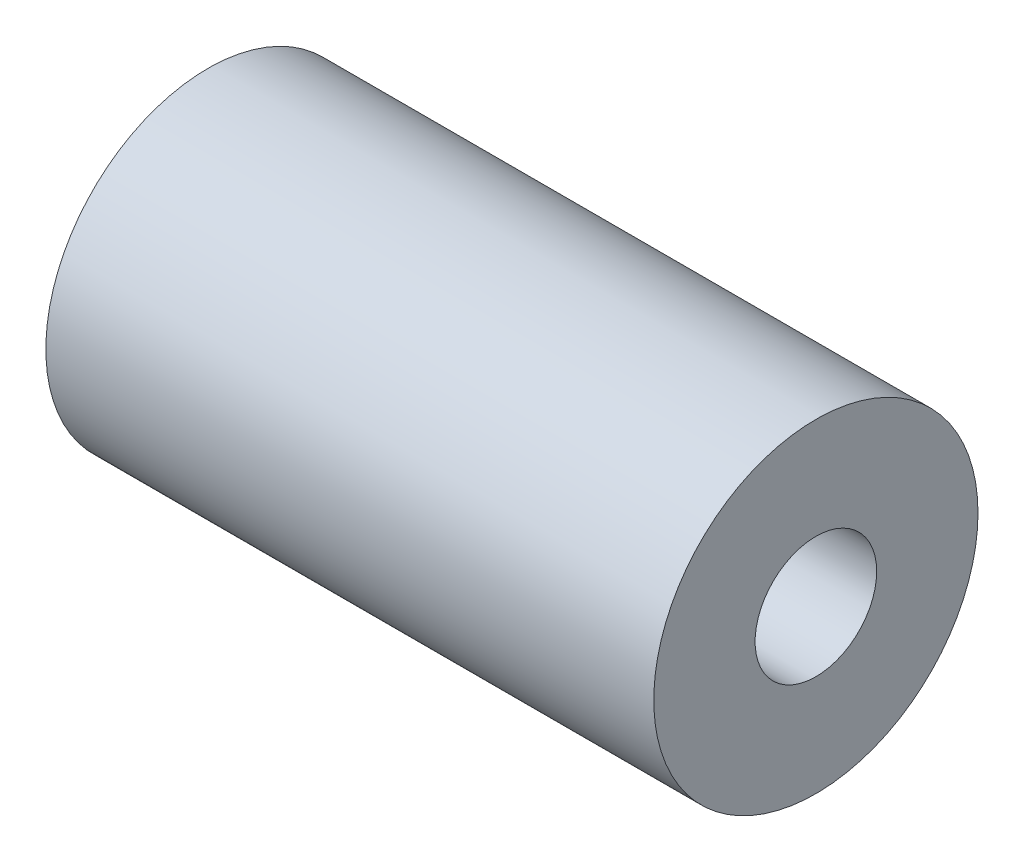
ISO-10303-21;
HEADER;
FILE_DESCRIPTION(('STEP AP214'),'2;1');
FILE_NAME('part.step','',(''),(''),'','','');
FILE_SCHEMA(('AUTOMOTIVE_DESIGN { 1 0 10303 214 1 1 1 1 }'));
ENDSEC;
DATA;
#1=APPLICATION_CONTEXT('core data for automotive mechanical design processes');
#2=APPLICATION_PROTOCOL_DEFINITION('international standard','automotive_design',2000,#1);
#3=PRODUCT_CONTEXT('',#1,'mechanical');
#4=PRODUCT('Part','Part','',(#3));
#5=PRODUCT_RELATED_PRODUCT_CATEGORY('part','',(#4));
#6=PRODUCT_DEFINITION_FORMATION('','',#4);
#7=PRODUCT_DEFINITION_CONTEXT('part definition',#1,'design');
#8=PRODUCT_DEFINITION('design','',#6,#7);
#9=PRODUCT_DEFINITION_SHAPE('','',#8);
#10=(LENGTH_UNIT() NAMED_UNIT(*) SI_UNIT(.MILLI.,.METRE.));
#11=(NAMED_UNIT(*) PLANE_ANGLE_UNIT() SI_UNIT($,.RADIAN.));
#12=(NAMED_UNIT(*) SI_UNIT($,.STERADIAN.) SOLID_ANGLE_UNIT());
#13=UNCERTAINTY_MEASURE_WITH_UNIT(LENGTH_MEASURE(1.E-05),#10,'distance_accuracy_value','');
#14=(GEOMETRIC_REPRESENTATION_CONTEXT(3) GLOBAL_UNCERTAINTY_ASSIGNED_CONTEXT((#13)) GLOBAL_UNIT_ASSIGNED_CONTEXT((#10,
#11,#12)) REPRESENTATION_CONTEXT('',''));
#15=CARTESIAN_POINT('',(0.,0.,0.));
#16=DIRECTION('',(0.,0.,1.));
#17=DIRECTION('',(1.,0.,0.));
#18=AXIS2_PLACEMENT_3D('',#15,#16,#17);
#19=CARTESIAN_POINT('',(15.,0.,0.));
#20=DIRECTION('',(1.,0.,0.));
#21=DIRECTION('',(0.,0.,-1.));
#22=AXIS2_PLACEMENT_3D('',#19,#20,#21);
#23=PLANE('',#22);
#24=CARTESIAN_POINT('',(15.,0.,0.));
#25=DIRECTION('',(1.,0.,0.));
#26=DIRECTION('',(0.,0.,-1.));
#27=AXIS2_PLACEMENT_3D('',#24,#25,#26);
#28=CIRCLE('',#27,4.);
#29=CARTESIAN_POINT('',(15.,0.,-4.));
#30=VERTEX_POINT('',#29);
#31=EDGE_CURVE('E10',#30,#30,#28,.T.);
#32=ORIENTED_EDGE('',*,*,#31,.T.);
#33=EDGE_LOOP('',(#32));
#34=FACE_BOUND('',#33,.T.);
#35=CARTESIAN_POINT('',(15.,0.,0.));
#36=DIRECTION('',(1.,0.,0.));
#37=DIRECTION('',(0.,0.,-1.));
#38=AXIS2_PLACEMENT_3D('',#35,#36,#37);
#39=CIRCLE('',#38,1.5);
#40=CARTESIAN_POINT('',(15.,0.,-1.5));
#41=VERTEX_POINT('',#40);
#42=EDGE_CURVE('E44',#41,#41,#39,.T.);
#43=ORIENTED_EDGE('',*,*,#42,.F.);
#44=EDGE_LOOP('',(#43));
#45=FACE_BOUND('',#44,.T.);
#46=ADVANCED_FACE('F33',(#34,#45),#23,.T.);
#47=CARTESIAN_POINT('',(0.,0.,0.));
#48=DIRECTION('',(1.,0.,0.));
#49=DIRECTION('',(0.,0.,-1.));
#50=AXIS2_PLACEMENT_3D('',#47,#48,#49);
#51=PLANE('',#50);
#52=CARTESIAN_POINT('',(0.,0.,0.));
#53=DIRECTION('',(1.,0.,0.));
#54=DIRECTION('',(0.,0.,-1.));
#55=AXIS2_PLACEMENT_3D('',#52,#53,#54);
#56=CIRCLE('',#55,4.);
#57=CARTESIAN_POINT('',(0.,0.,-4.));
#58=VERTEX_POINT('',#57);
#59=EDGE_CURVE('E37',#58,#58,#56,.T.);
#60=ORIENTED_EDGE('',*,*,#59,.F.);
#61=EDGE_LOOP('',(#60));
#62=FACE_BOUND('',#61,.T.);
#63=CARTESIAN_POINT('',(0.,0.,0.));
#64=DIRECTION('',(1.,0.,0.));
#65=DIRECTION('',(0.,0.,-1.));
#66=AXIS2_PLACEMENT_3D('',#63,#64,#65);
#67=CIRCLE('',#66,1.5);
#68=CARTESIAN_POINT('',(0.,0.,-1.5));
#69=VERTEX_POINT('',#68);
#70=EDGE_CURVE('E46',#69,#69,#67,.T.);
#71=ORIENTED_EDGE('',*,*,#70,.T.);
#72=EDGE_LOOP('',(#71));
#73=FACE_BOUND('',#72,.T.);
#74=ADVANCED_FACE('F56',(#62,#73),#51,.F.);
#75=CARTESIAN_POINT('',(15.,0.,0.));
#76=DIRECTION('',(-1.,0.,0.));
#77=DIRECTION('',(0.,0.,1.));
#78=AXIS2_PLACEMENT_3D('',#75,#76,#77);
#79=CYLINDRICAL_SURFACE('',#78,4.);
#80=ORIENTED_EDGE('',*,*,#31,.F.);
#81=EDGE_LOOP('',(#80));
#82=FACE_BOUND('',#81,.T.);
#83=ORIENTED_EDGE('',*,*,#59,.T.);
#84=EDGE_LOOP('',(#83));
#85=FACE_BOUND('',#84,.T.);
#86=ADVANCED_FACE('F35',(#82,#85),#79,.T.);
#87=CARTESIAN_POINT('',(15.,0.,0.));
#88=DIRECTION('',(-1.,0.,0.));
#89=DIRECTION('',(0.,0.,1.));
#90=AXIS2_PLACEMENT_3D('',#87,#88,#89);
#91=CYLINDRICAL_SURFACE('',#90,1.5);
#92=ORIENTED_EDGE('',*,*,#42,.T.);
#93=EDGE_LOOP('',(#92));
#94=FACE_BOUND('',#93,.T.);
#95=ORIENTED_EDGE('',*,*,#70,.F.);
#96=EDGE_LOOP('',(#95));
#97=FACE_BOUND('',#96,.T.);
#98=ADVANCED_FACE('F52',(#94,#97),#91,.F.);
#99=CLOSED_SHELL('',(#46,#74,#86,#98));
#100=MANIFOLD_SOLID_BREP('B2',#99);
#101=ADVANCED_BREP_SHAPE_REPRESENTATION('',(#18,#100),#14);
#102=SHAPE_DEFINITION_REPRESENTATION(#9,#101);
ENDSEC;
END-ISO-10303-21;
